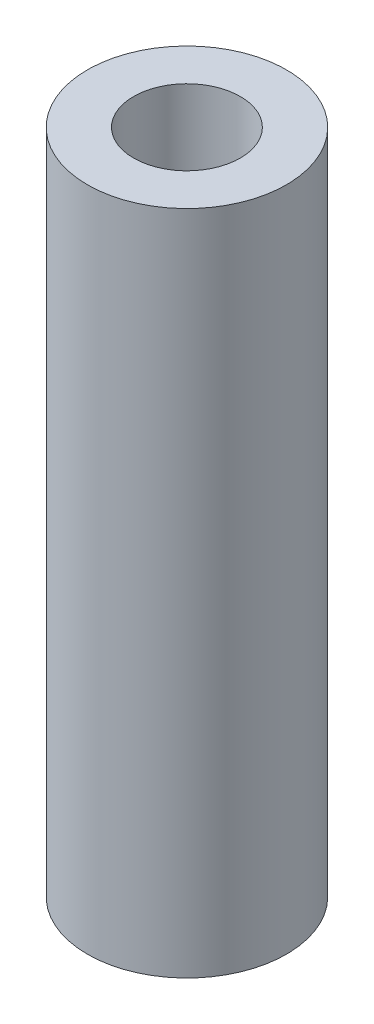
ISO-10303-21;
HEADER;
FILE_DESCRIPTION(('STEP AP214'),'2;1');
FILE_NAME('part.step','',(''),(''),'','','');
FILE_SCHEMA(('AUTOMOTIVE_DESIGN { 1 0 10303 214 1 1 1 1 }'));
ENDSEC;
DATA;
#1=APPLICATION_CONTEXT('core data for automotive mechanical design processes');
#2=APPLICATION_PROTOCOL_DEFINITION('international standard','automotive_design',2000,#1);
#3=PRODUCT_CONTEXT('',#1,'mechanical');
#4=PRODUCT('Part','Part','',(#3));
#5=PRODUCT_RELATED_PRODUCT_CATEGORY('part','',(#4));
#6=PRODUCT_DEFINITION_FORMATION('','',#4);
#7=PRODUCT_DEFINITION_CONTEXT('part definition',#1,'design');
#8=PRODUCT_DEFINITION('design','',#6,#7);
#9=PRODUCT_DEFINITION_SHAPE('','',#8);
#10=(LENGTH_UNIT() NAMED_UNIT(*) SI_UNIT(.MILLI.,.METRE.));
#11=(NAMED_UNIT(*) PLANE_ANGLE_UNIT() SI_UNIT($,.RADIAN.));
#12=(NAMED_UNIT(*) SI_UNIT($,.STERADIAN.) SOLID_ANGLE_UNIT());
#13=UNCERTAINTY_MEASURE_WITH_UNIT(LENGTH_MEASURE(1.E-05),#10,'distance_accuracy_value','');
#14=(GEOMETRIC_REPRESENTATION_CONTEXT(3) GLOBAL_UNCERTAINTY_ASSIGNED_CONTEXT((#13)) GLOBAL_UNIT_ASSIGNED_CONTEXT((#10,
#11,#12)) REPRESENTATION_CONTEXT('',''));
#15=CARTESIAN_POINT('',(0.,0.,0.));
#16=DIRECTION('',(0.,0.,1.));
#17=DIRECTION('',(1.,0.,0.));
#18=AXIS2_PLACEMENT_3D('',#15,#16,#17);
#19=CARTESIAN_POINT('',(0.,31.877,0.));
#20=DIRECTION('',(0.,1.,0.));
#21=DIRECTION('',(0.,0.,1.));
#22=AXIS2_PLACEMENT_3D('',#19,#20,#21);
#23=PLANE('',#22);
#24=CARTESIAN_POINT('',(0.,31.877,0.));
#25=DIRECTION('',(0.,1.,0.));
#26=DIRECTION('',(0.,0.,1.));
#27=AXIS2_PLACEMENT_3D('',#24,#25,#26);
#28=CIRCLE('',#27,4.7625);
#29=CARTESIAN_POINT('',(0.,31.877,4.7625));
#30=VERTEX_POINT('',#29);
#31=EDGE_CURVE('E10',#30,#30,#28,.T.);
#32=ORIENTED_EDGE('',*,*,#31,.T.);
#33=EDGE_LOOP('',(#32));
#34=FACE_BOUND('',#33,.T.);
#35=CARTESIAN_POINT('',(0.,31.877,0.));
#36=DIRECTION('',(0.,1.,0.));
#37=DIRECTION('',(0.,0.,1.));
#38=AXIS2_PLACEMENT_3D('',#35,#36,#37);
#39=CIRCLE('',#38,2.5527);
#40=CARTESIAN_POINT('',(0.,31.877,2.5527));
#41=VERTEX_POINT('',#40);
#42=EDGE_CURVE('E56',#41,#41,#39,.T.);
#43=ORIENTED_EDGE('',*,*,#42,.F.);
#44=EDGE_LOOP('',(#43));
#45=FACE_BOUND('',#44,.T.);
#46=ADVANCED_FACE('F43',(#34,#45),#23,.T.);
#47=CARTESIAN_POINT('',(0.,0.,0.));
#48=DIRECTION('',(0.,1.,0.));
#49=DIRECTION('',(0.,0.,1.));
#50=AXIS2_PLACEMENT_3D('',#47,#48,#49);
#51=PLANE('',#50);
#52=CARTESIAN_POINT('',(0.,0.,0.));
#53=DIRECTION('',(0.,1.,0.));
#54=DIRECTION('',(0.,0.,1.));
#55=AXIS2_PLACEMENT_3D('',#52,#53,#54);
#56=CIRCLE('',#55,4.7625);
#57=CARTESIAN_POINT('',(0.,0.,4.7625));
#58=VERTEX_POINT('',#57);
#59=EDGE_CURVE('E47',#58,#58,#56,.T.);
#60=ORIENTED_EDGE('',*,*,#59,.F.);
#61=EDGE_LOOP('',(#60));
#62=FACE_BOUND('',#61,.T.);
#63=CARTESIAN_POINT('',(0.,0.,0.));
#64=DIRECTION('',(0.,1.,0.));
#65=DIRECTION('',(0.,0.,1.));
#66=AXIS2_PLACEMENT_3D('',#63,#64,#65);
#67=CIRCLE('',#66,2.5527);
#68=CARTESIAN_POINT('',(0.,0.,2.5527));
#69=VERTEX_POINT('',#68);
#70=EDGE_CURVE('E58',#69,#69,#67,.T.);
#71=ORIENTED_EDGE('',*,*,#70,.T.);
#72=EDGE_LOOP('',(#71));
#73=FACE_BOUND('',#72,.T.);
#74=ADVANCED_FACE('F70',(#62,#73),#51,.F.);
#75=CARTESIAN_POINT('',(0.,31.877,0.));
#76=DIRECTION('',(0.,-1.,0.));
#77=DIRECTION('',(0.,0.,-1.));
#78=AXIS2_PLACEMENT_3D('',#75,#76,#77);
#79=CYLINDRICAL_SURFACE('',#78,4.7625);
#80=ORIENTED_EDGE('',*,*,#31,.F.);
#81=EDGE_LOOP('',(#80));
#82=FACE_BOUND('',#81,.T.);
#83=ORIENTED_EDGE('',*,*,#59,.T.);
#84=EDGE_LOOP('',(#83));
#85=FACE_BOUND('',#84,.T.);
#86=ADVANCED_FACE('F45',(#82,#85),#79,.T.);
#87=CARTESIAN_POINT('',(0.,31.877,0.));
#88=DIRECTION('',(0.,-1.,0.));
#89=DIRECTION('',(0.,0.,-1.));
#90=AXIS2_PLACEMENT_3D('',#87,#88,#89);
#91=CYLINDRICAL_SURFACE('',#90,2.5527);
#92=ORIENTED_EDGE('',*,*,#42,.T.);
#93=EDGE_LOOP('',(#92));
#94=FACE_BOUND('',#93,.T.);
#95=ORIENTED_EDGE('',*,*,#70,.F.);
#96=EDGE_LOOP('',(#95));
#97=FACE_BOUND('',#96,.T.);
#98=ADVANCED_FACE('F66',(#94,#97),#91,.F.);
#99=CLOSED_SHELL('',(#46,#74,#86,#98));
#100=MANIFOLD_SOLID_BREP('B2',#99);
#101=ADVANCED_BREP_SHAPE_REPRESENTATION('',(#18,#100),#14);
#102=SHAPE_DEFINITION_REPRESENTATION(#9,#101);
ENDSEC;
END-ISO-10303-21;
